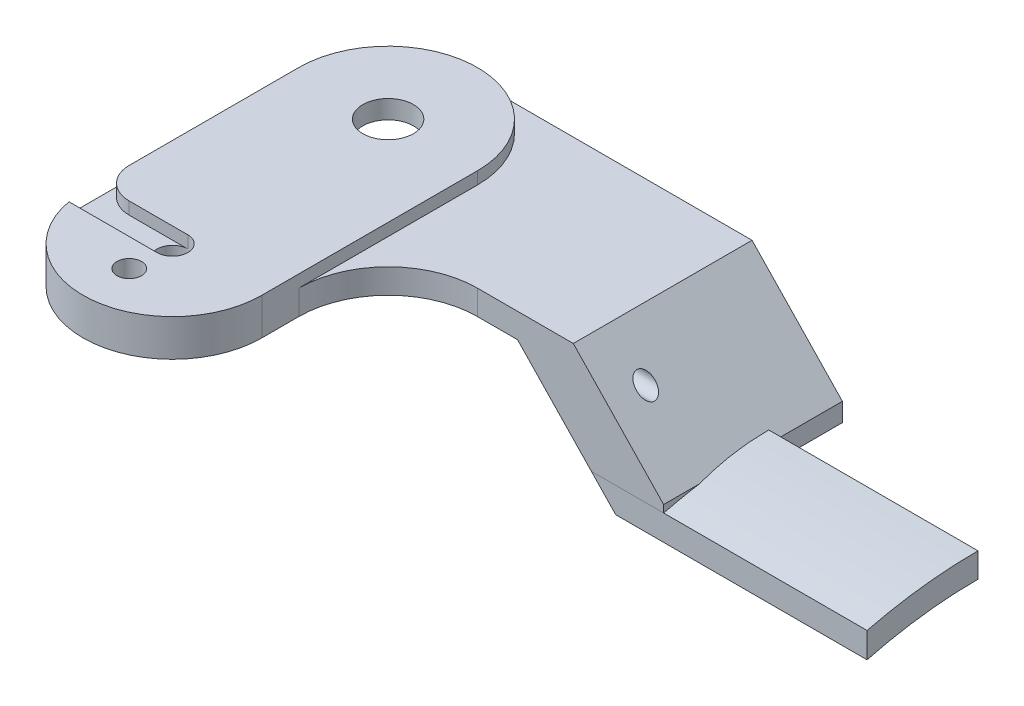
ISO-10303-21;
HEADER;
FILE_DESCRIPTION(('STEP AP214'),'2;1');
FILE_NAME('part.step','',(''),(''),'','','');
FILE_SCHEMA(('AUTOMOTIVE_DESIGN { 1 0 10303 214 1 1 1 1 }'));
ENDSEC;
DATA;
#1=APPLICATION_CONTEXT('core data for automotive mechanical design processes');
#2=APPLICATION_PROTOCOL_DEFINITION('international standard','automotive_design',2000,#1);
#3=PRODUCT_CONTEXT('',#1,'mechanical');
#4=PRODUCT('Part','Part','',(#3));
#5=PRODUCT_RELATED_PRODUCT_CATEGORY('part','',(#4));
#6=PRODUCT_DEFINITION_FORMATION('','',#4);
#7=PRODUCT_DEFINITION_CONTEXT('part definition',#1,'design');
#8=PRODUCT_DEFINITION('design','',#6,#7);
#9=PRODUCT_DEFINITION_SHAPE('','',#8);
#10=(LENGTH_UNIT() NAMED_UNIT(*) SI_UNIT(.MILLI.,.METRE.));
#11=(NAMED_UNIT(*) PLANE_ANGLE_UNIT() SI_UNIT($,.RADIAN.));
#12=(NAMED_UNIT(*) SI_UNIT($,.STERADIAN.) SOLID_ANGLE_UNIT());
#13=UNCERTAINTY_MEASURE_WITH_UNIT(LENGTH_MEASURE(1.E-05),#10,'distance_accuracy_value','');
#14=(GEOMETRIC_REPRESENTATION_CONTEXT(3) GLOBAL_UNCERTAINTY_ASSIGNED_CONTEXT((#13)) GLOBAL_UNIT_ASSIGNED_CONTEXT((#10,
#11,#12)) REPRESENTATION_CONTEXT('',''));
#15=CARTESIAN_POINT('',(0.,0.,0.));
#16=DIRECTION('',(0.,0.,1.));
#17=DIRECTION('',(1.,0.,0.));
#18=AXIS2_PLACEMENT_3D('',#15,#16,#17);
#19=CARTESIAN_POINT('',(-23.5536395656841,-70.9998669622686,-3.50034682436351));
#20=DIRECTION('',(1.,0.,0.));
#21=DIRECTION('',(0.,0.,-1.));
#22=AXIS2_PLACEMENT_3D('',#19,#20,#21);
#23=CYLINDRICAL_SURFACE('',#22,75.);
#24=CARTESIAN_POINT('',(68.0208515652504,-70.9998669622686,-3.50034682436351));
#25=DIRECTION('',(0.722093301654681,0.691795680606233,0.));
#26=DIRECTION('',(0.691795680606233,-0.722093301654681,0.));
#27=AXIS2_PLACEMENT_3D('',#24,#25,#26);
#28=ELLIPSE('',#27,103.864694255073,75.);
#29=CARTESIAN_POINT('',(-1.73215316737219,1.80801389003082,14.5));
#30=VERTEX_POINT('',#29);
#31=CARTESIAN_POINT('',(-3.83229528789652,4.00013303773141,-3.50034682436353));
#32=VERTEX_POINT('',#31);
#33=EDGE_CURVE('E110',#30,#32,#28,.F.);
#34=ORIENTED_EDGE('',*,*,#33,.F.);
#35=DIRECTION('',(1.,0.,0.));
#36=VECTOR('',#35,1.);
#37=CARTESIAN_POINT('',(-23.5536395656841,1.80801389003082,14.5));
#38=LINE('',#37,#36);
#39=CARTESIAN_POINT('',(43.,1.80801389003082,14.5));
#40=VERTEX_POINT('',#39);
#41=EDGE_CURVE('E138',#30,#40,#38,.T.);
#42=ORIENTED_EDGE('',*,*,#41,.T.);
#43=CARTESIAN_POINT('',(43.,-70.9998669622686,-3.50034682436351));
#44=DIRECTION('',(1.,0.,0.));
#45=DIRECTION('',(0.,0.,-1.));
#46=AXIS2_PLACEMENT_3D('',#43,#44,#45);
#47=CIRCLE('',#46,75.);
#48=CARTESIAN_POINT('',(43.,4.00013303773141,-3.50034682436353));
#49=VERTEX_POINT('',#48);
#50=EDGE_CURVE('E142',#49,#40,#47,.T.);
#51=ORIENTED_EDGE('',*,*,#50,.F.);
#52=DIRECTION('',(1.,0.,0.));
#53=VECTOR('',#52,1.);
#54=CARTESIAN_POINT('',(-23.5536395656841,4.00013303773141,-3.50034682436353));
#55=LINE('',#54,#53);
#56=EDGE_CURVE('E165',#32,#49,#55,.T.);
#57=ORIENTED_EDGE('',*,*,#56,.F.);
#58=EDGE_LOOP('',(#34,#42,#51,#57));
#59=FACE_BOUND('',#58,.T.);
#60=ADVANCED_FACE('F102',(#59),#23,.T.);
#61=CARTESIAN_POINT('',(-23.5536395656841,4.00013303773141,-3.50034682436353));
#62=DIRECTION('',(0.,0.,-1.));
#63=DIRECTION('',(0.,1.,0.));
#64=AXIS2_PLACEMENT_3D('',#61,#62,#63);
#65=PLANE('',#64);
#66=DIRECTION('',(0.691795680606233,-0.722093301654681,0.));
#67=VECTOR('',#66,1.);
#68=CARTESIAN_POINT('',(-13.2705611543302,13.8517536136439,-3.50034682436351));
#69=LINE('',#68,#67);
#70=CARTESIAN_POINT('',(-0.000127455728693437,0.000133037731414598,-3.50034682436353));
#71=VERTEX_POINT('',#70);
#72=EDGE_CURVE('E116',#32,#71,#69,.T.);
#73=ORIENTED_EDGE('',*,*,#72,.F.);
#74=ORIENTED_EDGE('',*,*,#56,.T.);
#75=DIRECTION('',(0.,1.,0.));
#76=VECTOR('',#75,1.);
#77=CARTESIAN_POINT('',(43.,4.00013303773141,-3.50034682436353));
#78=LINE('',#77,#76);
#79=CARTESIAN_POINT('',(43.,0.000133037731414598,-3.50034682436353));
#80=VERTEX_POINT('',#79);
#81=EDGE_CURVE('E147',#80,#49,#78,.T.);
#82=ORIENTED_EDGE('',*,*,#81,.F.);
#83=DIRECTION('',(1.,0.,0.));
#84=VECTOR('',#83,1.);
#85=CARTESIAN_POINT('',(-23.5536395656841,0.000133037731414598,-3.50034682436353));
#86=LINE('',#85,#84);
#87=EDGE_CURVE('E168',#71,#80,#86,.T.);
#88=ORIENTED_EDGE('',*,*,#87,.F.);
#89=EDGE_LOOP('',(#73,#74,#82,#88));
#90=FACE_BOUND('',#89,.T.);
#91=ADVANCED_FACE('F174',(#90),#65,.T.);
#92=CARTESIAN_POINT('',(-23.5536395656841,-70.9998669622686,-3.50034682436351));
#93=DIRECTION('',(1.,0.,0.));
#94=DIRECTION('',(0.,0.,-1.));
#95=AXIS2_PLACEMENT_3D('',#92,#93,#94);
#96=CYLINDRICAL_SURFACE('',#95,71.);
#97=CARTESIAN_POINT('',(68.0208515652504,-70.9998669622686,-3.50034682436351));
#98=DIRECTION('',(0.722093301654681,0.691795680606233,0.));
#99=DIRECTION('',(0.691795680606233,-0.722093301654681,0.));
#100=AXIS2_PLACEMENT_3D('',#97,#98,#99);
#101=ELLIPSE('',#100,98.3252438948029,71.);
#102=CARTESIAN_POINT('',(2.22221523058272,-2.31953852535277,14.5));
#103=VERTEX_POINT('',#102);
#104=EDGE_CURVE('E167',#71,#103,#101,.T.);
#105=ORIENTED_EDGE('',*,*,#104,.F.);
#106=ORIENTED_EDGE('',*,*,#87,.T.);
#107=CARTESIAN_POINT('',(43.,-70.9998669622686,-3.50034682436351));
#108=DIRECTION('',(-1.,0.,0.));
#109=DIRECTION('',(0.,0.,-1.));
#110=AXIS2_PLACEMENT_3D('',#107,#108,#109);
#111=CIRCLE('',#110,71.);
#112=CARTESIAN_POINT('',(43.,-2.31953852535277,14.5));
#113=VERTEX_POINT('',#112);
#114=EDGE_CURVE('E155',#113,#80,#111,.T.);
#115=ORIENTED_EDGE('',*,*,#114,.F.);
#116=DIRECTION('',(1.,0.,0.));
#117=VECTOR('',#116,1.);
#118=CARTESIAN_POINT('',(-23.5536395656841,-2.31953852535277,14.5));
#119=LINE('',#118,#117);
#120=EDGE_CURVE('E146',#103,#113,#119,.T.);
#121=ORIENTED_EDGE('',*,*,#120,.F.);
#122=EDGE_LOOP('',(#105,#106,#115,#121));
#123=FACE_BOUND('',#122,.T.);
#124=ADVANCED_FACE('F172',(#123),#96,.F.);
#125=CARTESIAN_POINT('',(-23.5536395656841,1.80801389003082,14.5));
#126=DIRECTION('',(0.,0.,1.));
#127=DIRECTION('',(0.,-1.,0.));
#128=AXIS2_PLACEMENT_3D('',#125,#126,#127);
#129=PLANE('',#128);
#130=DIRECTION('',(-0.691795680606233,0.722093301654681,0.));
#131=VECTOR('',#130,1.);
#132=CARTESIAN_POINT('',(-12.1755077038074,12.7087416178428,14.5));
#133=LINE('',#132,#131);
#134=EDGE_CURVE('E13',#103,#30,#133,.T.);
#135=ORIENTED_EDGE('',*,*,#134,.F.);
#136=ORIENTED_EDGE('',*,*,#120,.T.);
#137=DIRECTION('',(0.,-1.,0.));
#138=VECTOR('',#137,1.);
#139=CARTESIAN_POINT('',(43.,1.80801389003082,14.5));
#140=LINE('',#139,#138);
#141=EDGE_CURVE('E149',#40,#113,#140,.T.);
#142=ORIENTED_EDGE('',*,*,#141,.F.);
#143=ORIENTED_EDGE('',*,*,#41,.F.);
#144=EDGE_LOOP('',(#135,#136,#142,#143));
#145=FACE_BOUND('',#144,.T.);
#146=ADVANCED_FACE('F150',(#145),#129,.T.);
#147=CARTESIAN_POINT('',(43.,-70.9998669622686,-3.50034682436351));
#148=DIRECTION('',(1.,0.,0.));
#149=DIRECTION('',(0.,0.,-1.));
#150=AXIS2_PLACEMENT_3D('',#147,#148,#149);
#151=PLANE('',#150);
#152=ORIENTED_EDGE('',*,*,#50,.T.);
#153=ORIENTED_EDGE('',*,*,#141,.T.);
#154=ORIENTED_EDGE('',*,*,#114,.T.);
#155=ORIENTED_EDGE('',*,*,#81,.T.);
#156=EDGE_LOOP('',(#152,#153,#154,#155));
#157=FACE_BOUND('',#156,.T.);
#158=ADVANCED_FACE('F157',(#157),#151,.T.);
#159=CARTESIAN_POINT('',(0.,0.,14.5));
#160=DIRECTION('',(0.722093301654681,0.691795680606233,0.));
#161=DIRECTION('',(-0.691795680606233,0.722093301654681,0.));
#162=AXIS2_PLACEMENT_3D('',#159,#160,#161);
#163=PLANE('',#162);
#164=ORIENTED_EDGE('',*,*,#33,.T.);
#165=ORIENTED_EDGE('',*,*,#72,.T.);
#166=ORIENTED_EDGE('',*,*,#104,.T.);
#167=ORIENTED_EDGE('',*,*,#134,.T.);
#168=EDGE_LOOP('',(#164,#165,#166,#167));
#169=FACE_BOUND('',#168,.T.);
#170=ADVANCED_FACE('F176',(#169),#163,.F.);
#171=CLOSED_SHELL('',(#60,#91,#124,#146,#158,#170));
#172=MANIFOLD_SOLID_BREP('B2',#171);
#173=CARTESIAN_POINT('',(-63.7,18.3,14.5));
#174=DIRECTION('',(0.,-1.,0.));
#175=DIRECTION('',(1.,0.,0.));
#176=AXIS2_PLACEMENT_3D('',#173,#174,#175);
#177=PLANE('',#176);
#178=DIRECTION('',(-1.,0.,0.));
#179=VECTOR('',#178,1.);
#180=CARTESIAN_POINT('',(0.,18.3,37.5));
#181=LINE('',#180,#179);
#182=CARTESIAN_POINT('',(-49.2,18.3,37.5));
#183=VERTEX_POINT('',#182);
#184=CARTESIAN_POINT('',(-63.4828568570857,18.3,37.5));
#185=VERTEX_POINT('',#184);
#186=EDGE_CURVE('E466',#183,#185,#181,.T.);
#187=ORIENTED_EDGE('',*,*,#186,.F.);
#188=CARTESIAN_POINT('',(-49.2,18.3,35.));
#189=DIRECTION('',(0.,1.,0.));
#190=DIRECTION('',(0.,0.,1.));
#191=AXIS2_PLACEMENT_3D('',#188,#189,#190);
#192=CIRCLE('',#191,2.5);
#193=CARTESIAN_POINT('',(-49.2,18.3,32.5));
#194=VERTEX_POINT('',#193);
#195=EDGE_CURVE('E438',#194,#183,#192,.T.);
#196=ORIENTED_EDGE('',*,*,#195,.F.);
#197=DIRECTION('',(-1.,0.,0.));
#198=VECTOR('',#197,1.);
#199=CARTESIAN_POINT('',(0.,18.3,32.5));
#200=LINE('',#199,#198);
#201=CARTESIAN_POINT('',(-58.7,18.3,32.5));
#202=VERTEX_POINT('',#201);
#203=EDGE_CURVE('E251',#194,#202,#200,.T.);
#204=ORIENTED_EDGE('',*,*,#203,.T.);
#205=CARTESIAN_POINT('',(-58.7,18.3,27.5));
#206=DIRECTION('',(0.,1.,0.));
#207=DIRECTION('',(0.,0.,1.));
#208=AXIS2_PLACEMENT_3D('',#205,#206,#207);
#209=CIRCLE('',#208,5.);
#210=CARTESIAN_POINT('',(-63.7,18.3,27.5));
#211=VERTEX_POINT('',#210);
#212=EDGE_CURVE('E476',#202,#211,#209,.F.);
#213=ORIENTED_EDGE('',*,*,#212,.T.);
#214=DIRECTION('',(0.,0.,-1.));
#215=VECTOR('',#214,1.);
#216=CARTESIAN_POINT('',(-63.7,18.3,14.5));
#217=LINE('',#216,#215);
#218=CARTESIAN_POINT('',(-63.7,18.3,35.));
#219=VERTEX_POINT('',#218);
#220=EDGE_CURVE('E401',#219,#211,#217,.T.);
#221=ORIENTED_EDGE('',*,*,#220,.F.);
#222=CARTESIAN_POINT('',(-49.2,18.3,35.));
#223=DIRECTION('',(0.,-1.,0.));
#224=DIRECTION('',(1.,0.,0.));
#225=AXIS2_PLACEMENT_3D('',#222,#223,#224);
#226=CIRCLE('',#225,14.5);
#227=EDGE_CURVE('E434',#219,#185,#226,.F.);
#228=ORIENTED_EDGE('',*,*,#227,.T.);
#229=EDGE_LOOP('',(#187,#196,#204,#213,#221,#228));
#230=FACE_BOUND('',#229,.T.);
#231=ADVANCED_FACE('F226',(#230),#177,.F.);
#232=DIRECTION('',(0.,0.,-1.));
#233=VECTOR('',#232,1.);
#234=CARTESIAN_POINT('',(-34.7,18.3,0.));
#235=LINE('',#234,#233);
#236=CARTESIAN_POINT('',(-34.7,18.3,29.));
#237=VERTEX_POINT('',#236);
#238=CARTESIAN_POINT('',(-34.7,18.3,0.));
#239=VERTEX_POINT('',#238);
#240=EDGE_CURVE('E470',#237,#239,#235,.T.);
#241=ORIENTED_EDGE('',*,*,#240,.F.);
#242=CARTESIAN_POINT('',(-20.2,18.3,29.));
#243=DIRECTION('',(0.,-1.,0.));
#244=DIRECTION('',(1.,0.,0.));
#245=AXIS2_PLACEMENT_3D('',#242,#243,#244);
#246=CIRCLE('',#245,14.5);
#247=CARTESIAN_POINT('',(-20.2,18.3,14.5));
#248=VERTEX_POINT('',#247);
#249=EDGE_CURVE('E100',#237,#248,#246,.T.);
#250=ORIENTED_EDGE('',*,*,#249,.T.);
#251=DIRECTION('',(-1.,0.,0.));
#252=VECTOR('',#251,1.);
#253=CARTESIAN_POINT('',(-63.7,18.3,14.5));
#254=LINE('',#253,#252);
#255=CARTESIAN_POINT('',(-4.65804195804196,18.3,14.5));
#256=VERTEX_POINT('',#255);
#257=EDGE_CURVE('E494',#256,#248,#254,.T.);
#258=ORIENTED_EDGE('',*,*,#257,.F.);
#259=DIRECTION('',(0.,0.,-1.));
#260=VECTOR('',#259,1.);
#261=CARTESIAN_POINT('',(-4.65804195804196,18.3,14.5));
#262=LINE('',#261,#260);
#263=CARTESIAN_POINT('',(-4.65804195804196,18.3,-14.5));
#264=VERTEX_POINT('',#263);
#265=EDGE_CURVE('E404',#256,#264,#262,.T.);
#266=ORIENTED_EDGE('',*,*,#265,.T.);
#267=DIRECTION('',(-1.,0.,0.));
#268=VECTOR('',#267,1.);
#269=CARTESIAN_POINT('',(-63.7,18.3,-14.5));
#270=LINE('',#269,#268);
#271=CARTESIAN_POINT('',(-49.2,18.3,-14.5));
#272=VERTEX_POINT('',#271);
#273=EDGE_CURVE('E376',#264,#272,#270,.T.);
#274=ORIENTED_EDGE('',*,*,#273,.T.);
#275=CARTESIAN_POINT('',(-49.2,18.3,0.));
#276=DIRECTION('',(0.,1.,0.));
#277=DIRECTION('',(0.,0.,1.));
#278=AXIS2_PLACEMENT_3D('',#275,#276,#277);
#279=CIRCLE('',#278,14.5);
#280=EDGE_CURVE('E406',#239,#272,#279,.T.);
#281=ORIENTED_EDGE('',*,*,#280,.F.);
#282=EDGE_LOOP('',(#241,#250,#258,#266,#274,#281));
#283=FACE_BOUND('',#282,.T.);
#284=ADVANCED_FACE('F557',(#283),#177,.F.);
#285=CARTESIAN_POINT('',(-49.2,2.70344878854061,0.));
#286=DIRECTION('',(0.,1.,0.));
#287=DIRECTION('',(0.,0.,1.));
#288=AXIS2_PLACEMENT_3D('',#285,#286,#287);
#289=CYLINDRICAL_SURFACE('',#288,4.1);
#290=CARTESIAN_POINT('',(-49.2,20.3,0.));
#291=DIRECTION('',(0.,1.,0.));
#292=DIRECTION('',(0.,0.,1.));
#293=AXIS2_PLACEMENT_3D('',#290,#291,#292);
#294=CIRCLE('',#293,4.1);
#295=CARTESIAN_POINT('',(-49.2,20.3,4.1));
#296=VERTEX_POINT('',#295);
#297=EDGE_CURVE('E383',#296,#296,#294,.F.);
#298=ORIENTED_EDGE('',*,*,#297,.F.);
#299=EDGE_LOOP('',(#298));
#300=FACE_BOUND('',#299,.T.);
#301=CARTESIAN_POINT('',(-49.2,17.3,0.));
#302=DIRECTION('',(0.,-1.,0.));
#303=DIRECTION('',(1.,0.,0.));
#304=AXIS2_PLACEMENT_3D('',#301,#302,#303);
#305=CIRCLE('',#304,4.1);
#306=CARTESIAN_POINT('',(-45.1,17.3,0.));
#307=VERTEX_POINT('',#306);
#308=EDGE_CURVE('E407',#307,#307,#305,.F.);
#309=ORIENTED_EDGE('',*,*,#308,.F.);
#310=EDGE_LOOP('',(#309));
#311=FACE_BOUND('',#310,.T.);
#312=ADVANCED_FACE('F562',(#300,#311),#289,.F.);
#313=CARTESIAN_POINT('',(-4.65804195804196,18.3,14.5));
#314=DIRECTION('',(-0.722093301654681,-0.691795680606234,0.));
#315=DIRECTION('',(0.691795680606234,-0.722093301654681,0.));
#316=AXIS2_PLACEMENT_3D('',#313,#314,#315);
#317=PLANE('',#316);
#318=CARTESIAN_POINT('',(1.0902097902098,12.3,8.5));
#319=DIRECTION('',(-0.722093301654681,-0.691795680606234,0.));
#320=DIRECTION('',(0.691795680606234,-0.722093301654681,0.));
#321=AXIS2_PLACEMENT_3D('',#318,#319,#320);
#322=ELLIPSE('',#321,2.07729388510147,1.5);
#323=CARTESIAN_POINT('',(2.52727272727273,10.8,8.5));
#324=VERTEX_POINT('',#323);
#325=EDGE_CURVE('E513',#324,#324,#322,.T.);
#326=ORIENTED_EDGE('',*,*,#325,.T.);
#327=EDGE_LOOP('',(#326));
#328=FACE_BOUND('',#327,.T.);
#329=DIRECTION('',(-0.691795680606234,0.722093301654681,0.));
#330=VECTOR('',#329,1.);
#331=CARTESIAN_POINT('',(-4.65804195804196,18.3,-14.5));
#332=LINE('',#331,#330);
#333=CARTESIAN_POINT('',(10.,3.,-14.5));
#334=VERTEX_POINT('',#333);
#335=EDGE_CURVE('E367',#334,#264,#332,.T.);
#336=ORIENTED_EDGE('',*,*,#335,.T.);
#337=ORIENTED_EDGE('',*,*,#265,.F.);
#338=DIRECTION('',(-0.691795680606234,0.722093301654681,0.));
#339=VECTOR('',#338,1.);
#340=CARTESIAN_POINT('',(-4.65804195804196,18.3,14.5));
#341=LINE('',#340,#339);
#342=CARTESIAN_POINT('',(10.,3.,14.5));
#343=VERTEX_POINT('',#342);
#344=EDGE_CURVE('E369',#343,#256,#341,.T.);
#345=ORIENTED_EDGE('',*,*,#344,.F.);
#346=DIRECTION('',(0.,0.,-1.));
#347=VECTOR('',#346,1.);
#348=CARTESIAN_POINT('',(10.,3.,14.5));
#349=LINE('',#348,#347);
#350=EDGE_CURVE('E355',#343,#334,#349,.T.);
#351=ORIENTED_EDGE('',*,*,#350,.T.);
#352=EDGE_LOOP('',(#336,#337,#345,#351));
#353=FACE_BOUND('',#352,.T.);
#354=ADVANCED_FACE('F365',(#328,#353),#317,.F.);
#355=CARTESIAN_POINT('',(-63.7,14.3,14.5));
#356=DIRECTION('',(1.,0.,0.));
#357=DIRECTION('',(0.,0.,-1.));
#358=AXIS2_PLACEMENT_3D('',#355,#356,#357);
#359=PLANE('',#358);
#360=ORIENTED_EDGE('',*,*,#220,.T.);
#361=DIRECTION('',(0.,-1.,0.));
#362=VECTOR('',#361,1.);
#363=CARTESIAN_POINT('',(-63.7,77.6694169396901,27.5));
#364=LINE('',#363,#362);
#365=CARTESIAN_POINT('',(-63.7,20.3,27.5));
#366=VERTEX_POINT('',#365);
#367=EDGE_CURVE('E477',#366,#211,#364,.T.);
#368=ORIENTED_EDGE('',*,*,#367,.F.);
#369=DIRECTION('',(0.,0.,1.));
#370=VECTOR('',#369,1.);
#371=CARTESIAN_POINT('',(-63.7,20.3,0.));
#372=LINE('',#371,#370);
#373=CARTESIAN_POINT('',(-63.7,20.3,0.));
#374=VERTEX_POINT('',#373);
#375=EDGE_CURVE('E439',#374,#366,#372,.T.);
#376=ORIENTED_EDGE('',*,*,#375,.F.);
#377=DIRECTION('',(0.,-1.,0.));
#378=VECTOR('',#377,1.);
#379=CARTESIAN_POINT('',(-63.7,77.6694169396901,0.));
#380=LINE('',#379,#378);
#381=CARTESIAN_POINT('',(-63.7,18.3,0.));
#382=VERTEX_POINT('',#381);
#383=EDGE_CURVE('E473',#374,#382,#380,.T.);
#384=ORIENTED_EDGE('',*,*,#383,.T.);
#385=DIRECTION('',(0.,-1.,0.));
#386=VECTOR('',#385,1.);
#387=CARTESIAN_POINT('',(-63.7,14.3,0.));
#388=LINE('',#387,#386);
#389=CARTESIAN_POINT('',(-63.7,14.3,0.));
#390=VERTEX_POINT('',#389);
#391=EDGE_CURVE('E413',#382,#390,#388,.T.);
#392=ORIENTED_EDGE('',*,*,#391,.T.);
#393=DIRECTION('',(0.,0.,-1.));
#394=VECTOR('',#393,1.);
#395=CARTESIAN_POINT('',(-63.7,14.3,14.5));
#396=LINE('',#395,#394);
#397=CARTESIAN_POINT('',(-63.7,14.3,35.));
#398=VERTEX_POINT('',#397);
#399=EDGE_CURVE('E398',#398,#390,#396,.T.);
#400=ORIENTED_EDGE('',*,*,#399,.F.);
#401=DIRECTION('',(0.,1.,0.));
#402=VECTOR('',#401,1.);
#403=CARTESIAN_POINT('',(-63.7,14.3,35.));
#404=LINE('',#403,#402);
#405=EDGE_CURVE('E411',#398,#219,#404,.T.);
#406=ORIENTED_EDGE('',*,*,#405,.T.);
#407=EDGE_LOOP('',(#360,#368,#376,#384,#392,#400,#406));
#408=FACE_BOUND('',#407,.T.);
#409=ADVANCED_FACE('F566',(#408),#359,.F.);
#410=CARTESIAN_POINT('',(-13.7,14.3,14.5));
#411=DIRECTION('',(0.,1.,0.));
#412=DIRECTION('',(-1.,0.,0.));
#413=AXIS2_PLACEMENT_3D('',#410,#411,#412);
#414=PLANE('',#413);
#415=CARTESIAN_POINT('',(-49.2,14.3,42.));
#416=DIRECTION('',(0.,1.,0.));
#417=DIRECTION('',(-1.,0.,0.));
#418=AXIS2_PLACEMENT_3D('',#415,#416,#417);
#419=CIRCLE('',#418,2.);
#420=CARTESIAN_POINT('',(-51.2,14.3,42.));
#421=VERTEX_POINT('',#420);
#422=EDGE_CURVE('E509',#421,#421,#419,.F.);
#423=ORIENTED_EDGE('',*,*,#422,.F.);
#424=EDGE_LOOP('',(#423));
#425=FACE_BOUND('',#424,.T.);
#426=CARTESIAN_POINT('',(-49.2,14.3,35.));
#427=DIRECTION('',(0.,1.,0.));
#428=DIRECTION('',(-1.,0.,0.));
#429=AXIS2_PLACEMENT_3D('',#426,#427,#428);
#430=CIRCLE('',#429,2.5);
#431=CARTESIAN_POINT('',(-51.7,14.3,35.));
#432=VERTEX_POINT('',#431);
#433=EDGE_CURVE('E442',#432,#432,#430,.F.);
#434=ORIENTED_EDGE('',*,*,#433,.F.);
#435=EDGE_LOOP('',(#434));
#436=FACE_BOUND('',#435,.T.);
#437=CARTESIAN_POINT('',(-49.2,14.3,0.));
#438=DIRECTION('',(0.,-1.,0.));
#439=DIRECTION('',(1.,0.,0.));
#440=AXIS2_PLACEMENT_3D('',#437,#438,#439);
#441=CIRCLE('',#440,10.5);
#442=CARTESIAN_POINT('',(-38.7,14.3,0.));
#443=VERTEX_POINT('',#442);
#444=EDGE_CURVE('E485',#443,#443,#441,.T.);
#445=ORIENTED_EDGE('',*,*,#444,.F.);
#446=EDGE_LOOP('',(#445));
#447=FACE_BOUND('',#446,.T.);
#448=ORIENTED_EDGE('',*,*,#399,.T.);
#449=CARTESIAN_POINT('',(-49.2,14.3,0.));
#450=DIRECTION('',(0.,1.,0.));
#451=DIRECTION('',(-1.,0.,0.));
#452=AXIS2_PLACEMENT_3D('',#449,#450,#451);
#453=CIRCLE('',#452,14.5);
#454=CARTESIAN_POINT('',(-49.2,14.3,-14.5));
#455=VERTEX_POINT('',#454);
#456=EDGE_CURVE('E421',#390,#455,#453,.F.);
#457=ORIENTED_EDGE('',*,*,#456,.T.);
#458=DIRECTION('',(1.,0.,0.));
#459=VECTOR('',#458,1.);
#460=CARTESIAN_POINT('',(-13.7,14.3,-14.5));
#461=LINE('',#460,#459);
#462=CARTESIAN_POINT('',(-13.7,14.3,-14.5));
#463=VERTEX_POINT('',#462);
#464=EDGE_CURVE('E380',#455,#463,#461,.T.);
#465=ORIENTED_EDGE('',*,*,#464,.T.);
#466=DIRECTION('',(0.,0.,-1.));
#467=VECTOR('',#466,1.);
#468=CARTESIAN_POINT('',(-13.7,14.3,14.5));
#469=LINE('',#468,#467);
#470=CARTESIAN_POINT('',(-13.7,14.3,14.5));
#471=VERTEX_POINT('',#470);
#472=EDGE_CURVE('E395',#471,#463,#469,.T.);
#473=ORIENTED_EDGE('',*,*,#472,.F.);
#474=DIRECTION('',(1.,0.,0.));
#475=VECTOR('',#474,1.);
#476=CARTESIAN_POINT('',(-13.7,14.3,14.5));
#477=LINE('',#476,#475);
#478=CARTESIAN_POINT('',(-20.2,14.3,14.5));
#479=VERTEX_POINT('',#478);
#480=EDGE_CURVE('E497',#479,#471,#477,.T.);
#481=ORIENTED_EDGE('',*,*,#480,.F.);
#482=CARTESIAN_POINT('',(-20.2,14.3,29.));
#483=DIRECTION('',(0.,1.,0.));
#484=DIRECTION('',(-1.,0.,0.));
#485=AXIS2_PLACEMENT_3D('',#482,#483,#484);
#486=CIRCLE('',#485,14.5);
#487=CARTESIAN_POINT('',(-34.7,14.3,29.));
#488=VERTEX_POINT('',#487);
#489=EDGE_CURVE('E235',#479,#488,#486,.T.);
#490=ORIENTED_EDGE('',*,*,#489,.T.);
#491=DIRECTION('',(0.,0.,-1.));
#492=VECTOR('',#491,1.);
#493=CARTESIAN_POINT('',(-34.7,14.3,49.5));
#494=LINE('',#493,#492);
#495=CARTESIAN_POINT('',(-34.7,14.3,35.));
#496=VERTEX_POINT('',#495);
#497=EDGE_CURVE('E482',#496,#488,#494,.T.);
#498=ORIENTED_EDGE('',*,*,#497,.F.);
#499=CARTESIAN_POINT('',(-49.2,14.3,35.));
#500=DIRECTION('',(0.,1.,0.));
#501=DIRECTION('',(-1.,0.,0.));
#502=AXIS2_PLACEMENT_3D('',#499,#500,#501);
#503=CIRCLE('',#502,14.5);
#504=CARTESIAN_POINT('',(-49.2,14.3,49.5));
#505=VERTEX_POINT('',#504);
#506=EDGE_CURVE('E419',#496,#505,#503,.F.);
#507=ORIENTED_EDGE('',*,*,#506,.T.);
#508=CARTESIAN_POINT('',(-49.2,14.3,35.));
#509=DIRECTION('',(0.,1.,0.));
#510=DIRECTION('',(-1.,0.,0.));
#511=AXIS2_PLACEMENT_3D('',#508,#509,#510);
#512=CIRCLE('',#511,14.5);
#513=EDGE_CURVE('E417',#505,#398,#512,.F.);
#514=ORIENTED_EDGE('',*,*,#513,.T.);
#515=EDGE_LOOP('',(#448,#457,#465,#473,#481,#490,#498,#507,#514));
#516=FACE_BOUND('',#515,.T.);
#517=ADVANCED_FACE('F595',(#425,#436,#447,#516),#414,.F.);
#518=CARTESIAN_POINT('',(0.,0.,14.5));
#519=DIRECTION('',(0.722093301654681,0.691795680606233,0.));
#520=DIRECTION('',(-0.691795680606233,0.722093301654681,0.));
#521=AXIS2_PLACEMENT_3D('',#518,#519,#520);
#522=PLANE('',#521);
#523=CARTESIAN_POINT('',(-11.7839160839161,12.3,8.5));
#524=DIRECTION('',(0.722093301654681,0.691795680606233,0.));
#525=DIRECTION('',(0.691795680606233,-0.722093301654681,0.));
#526=AXIS2_PLACEMENT_3D('',#523,#524,#525);
#527=ELLIPSE('',#526,2.07729388510147,1.5);
#528=CARTESIAN_POINT('',(-10.3468531468531,10.8,8.5));
#529=VERTEX_POINT('',#528);
#530=EDGE_CURVE('E230',#529,#529,#527,.T.);
#531=ORIENTED_EDGE('',*,*,#530,.T.);
#532=EDGE_LOOP('',(#531));
#533=FACE_BOUND('',#532,.T.);
#534=DIRECTION('',(0.691795680606233,-0.722093301654681,0.));
#535=VECTOR('',#534,1.);
#536=CARTESIAN_POINT('',(0.,0.,-14.5));
#537=LINE('',#536,#535);
#538=CARTESIAN_POINT('',(0.,0.,-14.5));
#539=VERTEX_POINT('',#538);
#540=EDGE_CURVE('E389',#463,#539,#537,.T.);
#541=ORIENTED_EDGE('',*,*,#540,.T.);
#542=DIRECTION('',(0.,0.,-1.));
#543=VECTOR('',#542,1.);
#544=CARTESIAN_POINT('',(0.,0.,14.5));
#545=LINE('',#544,#543);
#546=CARTESIAN_POINT('',(0.,0.,14.5));
#547=VERTEX_POINT('',#546);
#548=EDGE_CURVE('E370',#547,#539,#545,.T.);
#549=ORIENTED_EDGE('',*,*,#548,.F.);
#550=DIRECTION('',(0.691795680606233,-0.722093301654681,0.));
#551=VECTOR('',#550,1.);
#552=CARTESIAN_POINT('',(0.,0.,14.5));
#553=LINE('',#552,#551);
#554=EDGE_CURVE('E498',#471,#547,#553,.T.);
#555=ORIENTED_EDGE('',*,*,#554,.F.);
#556=ORIENTED_EDGE('',*,*,#472,.T.);
#557=EDGE_LOOP('',(#541,#549,#555,#556));
#558=FACE_BOUND('',#557,.T.);
#559=ADVANCED_FACE('F597',(#533,#558),#522,.F.);
#560=CARTESIAN_POINT('',(43.,0.,14.5));
#561=DIRECTION('',(0.,1.,0.));
#562=DIRECTION('',(-1.,0.,0.));
#563=AXIS2_PLACEMENT_3D('',#560,#561,#562);
#564=PLANE('',#563);
#565=DIRECTION('',(1.,0.,0.));
#566=VECTOR('',#565,1.);
#567=CARTESIAN_POINT('',(43.,0.,-14.5));
#568=LINE('',#567,#566);
#569=CARTESIAN_POINT('',(10.,0.,-14.5));
#570=VERTEX_POINT('',#569);
#571=EDGE_CURVE('E391',#539,#570,#568,.T.);
#572=ORIENTED_EDGE('',*,*,#571,.T.);
#573=DIRECTION('',(0.,0.,1.));
#574=VECTOR('',#573,1.);
#575=CARTESIAN_POINT('',(10.,0.,-14.5));
#576=LINE('',#575,#574);
#577=CARTESIAN_POINT('',(10.,0.,14.5));
#578=VERTEX_POINT('',#577);
#579=EDGE_CURVE('E243',#570,#578,#576,.T.);
#580=ORIENTED_EDGE('',*,*,#579,.T.);
#581=DIRECTION('',(1.,0.,0.));
#582=VECTOR('',#581,1.);
#583=CARTESIAN_POINT('',(43.,0.,14.5));
#584=LINE('',#583,#582);
#585=EDGE_CURVE('E371',#547,#578,#584,.T.);
#586=ORIENTED_EDGE('',*,*,#585,.F.);
#587=ORIENTED_EDGE('',*,*,#548,.T.);
#588=EDGE_LOOP('',(#572,#580,#586,#587));
#589=FACE_BOUND('',#588,.T.);
#590=ADVANCED_FACE('F507',(#589),#564,.F.);
#591=CARTESIAN_POINT('',(0.,0.,14.5));
#592=DIRECTION('',(0.,0.,1.));
#593=DIRECTION('',(1.,0.,0.));
#594=AXIS2_PLACEMENT_3D('',#591,#592,#593);
#595=PLANE('',#594);
#596=DIRECTION('',(0.,-1.,0.));
#597=VECTOR('',#596,1.);
#598=CARTESIAN_POINT('',(10.,3.,14.5));
#599=LINE('',#598,#597);
#600=EDGE_CURVE('E505',#343,#578,#599,.T.);
#601=ORIENTED_EDGE('',*,*,#600,.F.);
#602=ORIENTED_EDGE('',*,*,#344,.T.);
#603=ORIENTED_EDGE('',*,*,#257,.T.);
#604=DIRECTION('',(0.,-1.,0.));
#605=VECTOR('',#604,1.);
#606=CARTESIAN_POINT('',(-20.2,14.3,14.5));
#607=LINE('',#606,#605);
#608=EDGE_CURVE('E425',#248,#479,#607,.T.);
#609=ORIENTED_EDGE('',*,*,#608,.T.);
#610=ORIENTED_EDGE('',*,*,#480,.T.);
#611=ORIENTED_EDGE('',*,*,#554,.T.);
#612=ORIENTED_EDGE('',*,*,#585,.T.);
#613=EDGE_LOOP('',(#601,#602,#603,#609,#610,#611,#612));
#614=FACE_BOUND('',#613,.T.);
#615=ADVANCED_FACE('F504',(#614),#595,.T.);
#616=CARTESIAN_POINT('',(0.,0.,-14.5));
#617=DIRECTION('',(0.,0.,1.));
#618=DIRECTION('',(1.,0.,0.));
#619=AXIS2_PLACEMENT_3D('',#616,#617,#618);
#620=PLANE('',#619);
#621=ORIENTED_EDGE('',*,*,#335,.F.);
#622=DIRECTION('',(0.,1.,0.));
#623=VECTOR('',#622,1.);
#624=CARTESIAN_POINT('',(10.,-34.7850542618522,-14.5));
#625=LINE('',#624,#623);
#626=EDGE_CURVE('E352',#570,#334,#625,.T.);
#627=ORIENTED_EDGE('',*,*,#626,.F.);
#628=ORIENTED_EDGE('',*,*,#571,.F.);
#629=ORIENTED_EDGE('',*,*,#540,.F.);
#630=ORIENTED_EDGE('',*,*,#464,.F.);
#631=DIRECTION('',(0.,-1.,0.));
#632=VECTOR('',#631,1.);
#633=CARTESIAN_POINT('',(-49.2,0.,-14.5));
#634=LINE('',#633,#632);
#635=EDGE_CURVE('E423',#455,#272,#634,.F.);
#636=ORIENTED_EDGE('',*,*,#635,.T.);
#637=ORIENTED_EDGE('',*,*,#273,.F.);
#638=EDGE_LOOP('',(#621,#627,#628,#629,#630,#636,#637));
#639=FACE_BOUND('',#638,.T.);
#640=ADVANCED_FACE('F373',(#639),#620,.F.);
#641=CARTESIAN_POINT('',(-49.2,20.3,0.));
#642=DIRECTION('',(0.,-1.,0.));
#643=DIRECTION('',(0.,0.,-1.));
#644=AXIS2_PLACEMENT_3D('',#641,#642,#643);
#645=CYLINDRICAL_SURFACE('',#644,14.5);
#646=CARTESIAN_POINT('',(-49.2,20.3,0.));
#647=DIRECTION('',(0.,1.,0.));
#648=DIRECTION('',(0.,0.,1.));
#649=AXIS2_PLACEMENT_3D('',#646,#647,#648);
#650=CIRCLE('',#649,14.5);
#651=CARTESIAN_POINT('',(-34.7,20.3,0.));
#652=VERTEX_POINT('',#651);
#653=EDGE_CURVE('E378',#652,#374,#650,.T.);
#654=ORIENTED_EDGE('',*,*,#653,.F.);
#655=DIRECTION('',(0.,-1.,0.));
#656=VECTOR('',#655,1.);
#657=CARTESIAN_POINT('',(-34.7,77.6694169396901,0.));
#658=LINE('',#657,#656);
#659=EDGE_CURVE('E471',#652,#239,#658,.T.);
#660=ORIENTED_EDGE('',*,*,#659,.T.);
#661=ORIENTED_EDGE('',*,*,#280,.T.);
#662=EDGE_CURVE('E414',#272,#382,#279,.T.);
#663=ORIENTED_EDGE('',*,*,#662,.T.);
#664=ORIENTED_EDGE('',*,*,#383,.F.);
#665=EDGE_LOOP('',(#654,#660,#661,#663,#664));
#666=FACE_BOUND('',#665,.T.);
#667=ADVANCED_FACE('F541',(#666),#645,.T.);
#668=CARTESIAN_POINT('',(0.,20.3,0.));
#669=DIRECTION('',(0.,1.,0.));
#670=DIRECTION('',(0.,0.,1.));
#671=AXIS2_PLACEMENT_3D('',#668,#669,#670);
#672=PLANE('',#671);
#673=CARTESIAN_POINT('',(-49.2,20.3,42.));
#674=DIRECTION('',(0.,1.,0.));
#675=DIRECTION('',(0.,0.,1.));
#676=AXIS2_PLACEMENT_3D('',#673,#674,#675);
#677=CIRCLE('',#676,2.);
#678=CARTESIAN_POINT('',(-49.2,20.3,44.));
#679=VERTEX_POINT('',#678);
#680=EDGE_CURVE('E905',#679,#679,#677,.T.);
#681=ORIENTED_EDGE('',*,*,#680,.F.);
#682=EDGE_LOOP('',(#681));
#683=FACE_BOUND('',#682,.T.);
#684=ORIENTED_EDGE('',*,*,#297,.T.);
#685=EDGE_LOOP('',(#684));
#686=FACE_BOUND('',#685,.T.);
#687=ORIENTED_EDGE('',*,*,#653,.T.);
#688=ORIENTED_EDGE('',*,*,#375,.T.);
#689=CARTESIAN_POINT('',(-58.7,20.3,27.5));
#690=DIRECTION('',(0.,1.,0.));
#691=DIRECTION('',(0.,0.,1.));
#692=AXIS2_PLACEMENT_3D('',#689,#690,#691);
#693=CIRCLE('',#692,5.);
#694=CARTESIAN_POINT('',(-58.7,20.3,32.5));
#695=VERTEX_POINT('',#694);
#696=EDGE_CURVE('E455',#695,#366,#693,.F.);
#697=ORIENTED_EDGE('',*,*,#696,.F.);
#698=DIRECTION('',(-1.,0.,0.));
#699=VECTOR('',#698,1.);
#700=CARTESIAN_POINT('',(0.,20.3,32.5));
#701=LINE('',#700,#699);
#702=CARTESIAN_POINT('',(-49.2,20.3,32.5));
#703=VERTEX_POINT('',#702);
#704=EDGE_CURVE('E460',#703,#695,#701,.T.);
#705=ORIENTED_EDGE('',*,*,#704,.F.);
#706=CARTESIAN_POINT('',(-49.2,20.3,35.));
#707=DIRECTION('',(0.,1.,0.));
#708=DIRECTION('',(0.,0.,1.));
#709=AXIS2_PLACEMENT_3D('',#706,#707,#708);
#710=CIRCLE('',#709,2.5);
#711=CARTESIAN_POINT('',(-49.2,20.3,37.5));
#712=VERTEX_POINT('',#711);
#713=EDGE_CURVE('E521',#703,#712,#710,.F.);
#714=ORIENTED_EDGE('',*,*,#713,.T.);
#715=DIRECTION('',(-1.,0.,0.));
#716=VECTOR('',#715,1.);
#717=CARTESIAN_POINT('',(0.,20.3,37.5));
#718=LINE('',#717,#716);
#719=CARTESIAN_POINT('',(-63.4828568570857,20.3,37.5));
#720=VERTEX_POINT('',#719);
#721=EDGE_CURVE('E525',#712,#720,#718,.T.);
#722=ORIENTED_EDGE('',*,*,#721,.T.);
#723=CARTESIAN_POINT('',(-49.2,20.3,35.));
#724=DIRECTION('',(0.,1.,0.));
#725=DIRECTION('',(0.,0.,1.));
#726=AXIS2_PLACEMENT_3D('',#723,#724,#725);
#727=CIRCLE('',#726,14.5);
#728=CARTESIAN_POINT('',(-34.7,20.3,35.));
#729=VERTEX_POINT('',#728);
#730=EDGE_CURVE('E451',#720,#729,#727,.T.);
#731=ORIENTED_EDGE('',*,*,#730,.T.);
#732=DIRECTION('',(0.,0.,-1.));
#733=VECTOR('',#732,1.);
#734=CARTESIAN_POINT('',(-34.7,20.3,0.));
#735=LINE('',#734,#733);
#736=EDGE_CURVE('E445',#729,#652,#735,.T.);
#737=ORIENTED_EDGE('',*,*,#736,.T.);
#738=EDGE_LOOP('',(#687,#688,#697,#705,#714,#722,#731,#737));
#739=FACE_BOUND('',#738,.T.);
#740=ADVANCED_FACE('F538',(#683,#686,#739),#672,.T.);
#741=CARTESIAN_POINT('',(-49.2,17.3,0.));
#742=DIRECTION('',(0.,-1.,0.));
#743=DIRECTION('',(1.,0.,0.));
#744=AXIS2_PLACEMENT_3D('',#741,#742,#743);
#745=PLANE('',#744);
#746=CARTESIAN_POINT('',(-49.2,17.3,0.));
#747=DIRECTION('',(0.,-1.,0.));
#748=DIRECTION('',(1.,0.,0.));
#749=AXIS2_PLACEMENT_3D('',#746,#747,#748);
#750=CIRCLE('',#749,10.5);
#751=CARTESIAN_POINT('',(-38.7,17.3,0.));
#752=VERTEX_POINT('',#751);
#753=EDGE_CURVE('E410',#752,#752,#750,.T.);
#754=ORIENTED_EDGE('',*,*,#753,.T.);
#755=EDGE_LOOP('',(#754));
#756=FACE_BOUND('',#755,.T.);
#757=ORIENTED_EDGE('',*,*,#308,.T.);
#758=EDGE_LOOP('',(#757));
#759=FACE_BOUND('',#758,.T.);
#760=ADVANCED_FACE('F540',(#756,#759),#745,.T.);
#761=CARTESIAN_POINT('',(-49.2,17.3,0.));
#762=DIRECTION('',(0.,-1.,0.));
#763=DIRECTION('',(1.,0.,0.));
#764=AXIS2_PLACEMENT_3D('',#761,#762,#763);
#765=CYLINDRICAL_SURFACE('',#764,10.5);
#766=ORIENTED_EDGE('',*,*,#753,.F.);
#767=EDGE_LOOP('',(#766));
#768=FACE_BOUND('',#767,.T.);
#769=ORIENTED_EDGE('',*,*,#444,.T.);
#770=EDGE_LOOP('',(#769));
#771=FACE_BOUND('',#770,.T.);
#772=ADVANCED_FACE('F548',(#768,#771),#765,.F.);
#773=CARTESIAN_POINT('',(-34.7,14.3,49.5));
#774=DIRECTION('',(1.,0.,0.));
#775=DIRECTION('',(0.,0.,-1.));
#776=AXIS2_PLACEMENT_3D('',#773,#774,#775);
#777=PLANE('',#776);
#778=ORIENTED_EDGE('',*,*,#497,.T.);
#779=DIRECTION('',(0.,-1.,0.));
#780=VECTOR('',#779,1.);
#781=CARTESIAN_POINT('',(-34.7,18.3,29.));
#782=LINE('',#781,#780);
#783=EDGE_CURVE('E431',#488,#237,#782,.F.);
#784=ORIENTED_EDGE('',*,*,#783,.T.);
#785=ORIENTED_EDGE('',*,*,#240,.T.);
#786=ORIENTED_EDGE('',*,*,#659,.F.);
#787=ORIENTED_EDGE('',*,*,#736,.F.);
#788=DIRECTION('',(0.,-1.,0.));
#789=VECTOR('',#788,1.);
#790=CARTESIAN_POINT('',(-34.7,14.3,35.));
#791=LINE('',#790,#789);
#792=EDGE_CURVE('E428',#729,#496,#791,.T.);
#793=ORIENTED_EDGE('',*,*,#792,.T.);
#794=EDGE_LOOP('',(#778,#784,#785,#786,#787,#793));
#795=FACE_BOUND('',#794,.T.);
#796=ADVANCED_FACE('F722',(#795),#777,.T.);
#797=CARTESIAN_POINT('',(-49.2,7.22893218813451,35.));
#798=DIRECTION('',(0.,1.,0.));
#799=DIRECTION('',(0.,0.,1.));
#800=AXIS2_PLACEMENT_3D('',#797,#798,#799);
#801=CYLINDRICAL_SURFACE('',#800,2.5);
#802=ORIENTED_EDGE('',*,*,#433,.T.);
#803=EDGE_LOOP('',(#802));
#804=FACE_BOUND('',#803,.T.);
#805=ORIENTED_EDGE('',*,*,#195,.T.);
#806=DIRECTION('',(0.,-1.,0.));
#807=VECTOR('',#806,1.);
#808=CARTESIAN_POINT('',(-49.2,77.6694169396901,37.5));
#809=LINE('',#808,#807);
#810=EDGE_CURVE('E463',#712,#183,#809,.T.);
#811=ORIENTED_EDGE('',*,*,#810,.F.);
#812=ORIENTED_EDGE('',*,*,#713,.F.);
#813=DIRECTION('',(0.,-1.,0.));
#814=VECTOR('',#813,1.);
#815=CARTESIAN_POINT('',(-49.2,77.6694169396901,32.5));
#816=LINE('',#815,#814);
#817=EDGE_CURVE('E459',#703,#194,#816,.T.);
#818=ORIENTED_EDGE('',*,*,#817,.T.);
#819=EDGE_LOOP('',(#805,#811,#812,#818));
#820=FACE_BOUND('',#819,.T.);
#821=ADVANCED_FACE('F574',(#804,#820),#801,.F.);
#822=CARTESIAN_POINT('',(-49.2,14.3,0.));
#823=DIRECTION('',(0.,-1.,0.));
#824=DIRECTION('',(0.,0.,-1.));
#825=AXIS2_PLACEMENT_3D('',#822,#823,#824);
#826=CYLINDRICAL_SURFACE('',#825,14.5);
#827=ORIENTED_EDGE('',*,*,#662,.F.);
#828=ORIENTED_EDGE('',*,*,#635,.F.);
#829=ORIENTED_EDGE('',*,*,#456,.F.);
#830=ORIENTED_EDGE('',*,*,#391,.F.);
#831=EDGE_LOOP('',(#827,#828,#829,#830));
#832=FACE_BOUND('',#831,.T.);
#833=ADVANCED_FACE('F571',(#832),#826,.T.);
#834=CARTESIAN_POINT('',(-20.2,0.,29.));
#835=DIRECTION('',(0.,1.,0.));
#836=DIRECTION('',(0.,0.,1.));
#837=AXIS2_PLACEMENT_3D('',#834,#835,#836);
#838=CYLINDRICAL_SURFACE('',#837,14.5);
#839=ORIENTED_EDGE('',*,*,#249,.F.);
#840=ORIENTED_EDGE('',*,*,#783,.F.);
#841=ORIENTED_EDGE('',*,*,#489,.F.);
#842=ORIENTED_EDGE('',*,*,#608,.F.);
#843=EDGE_LOOP('',(#839,#840,#841,#842));
#844=FACE_BOUND('',#843,.T.);
#845=ADVANCED_FACE('F573',(#844),#838,.F.);
#846=CARTESIAN_POINT('',(-49.2,14.3,35.));
#847=DIRECTION('',(0.,1.,0.));
#848=DIRECTION('',(0.,0.,1.));
#849=AXIS2_PLACEMENT_3D('',#846,#847,#848);
#850=CYLINDRICAL_SURFACE('',#849,14.5);
#851=DIRECTION('',(0.,1.,0.));
#852=VECTOR('',#851,1.);
#853=CARTESIAN_POINT('',(-49.2,0.,49.5));
#854=LINE('',#853,#852);
#855=CARTESIAN_POINT('',(-49.2,18.3,49.5));
#856=VERTEX_POINT('',#855);
#857=EDGE_CURVE('E436',#856,#505,#854,.F.);
#858=ORIENTED_EDGE('',*,*,#857,.F.);
#859=ORIENTED_EDGE('',*,*,#857,.T.);
#860=ORIENTED_EDGE('',*,*,#506,.F.);
#861=ORIENTED_EDGE('',*,*,#792,.F.);
#862=ORIENTED_EDGE('',*,*,#730,.F.);
#863=DIRECTION('',(0.,-1.,0.));
#864=VECTOR('',#863,1.);
#865=CARTESIAN_POINT('',(-63.4828568570857,77.6694169396901,37.5));
#866=LINE('',#865,#864);
#867=EDGE_CURVE('E467',#720,#185,#866,.T.);
#868=ORIENTED_EDGE('',*,*,#867,.T.);
#869=ORIENTED_EDGE('',*,*,#227,.F.);
#870=ORIENTED_EDGE('',*,*,#405,.F.);
#871=ORIENTED_EDGE('',*,*,#513,.F.);
#872=EDGE_LOOP('',(#858,#859,#860,#861,#862,#868,#869,#870,#871));
#873=FACE_BOUND('',#872,.T.);
#874=ADVANCED_FACE('F228',(#873),#850,.T.);
#875=CARTESIAN_POINT('',(0.,77.6694169396901,37.5));
#876=DIRECTION('',(0.,0.,1.));
#877=DIRECTION('',(1.,0.,0.));
#878=AXIS2_PLACEMENT_3D('',#875,#876,#877);
#879=PLANE('',#878);
#880=ORIENTED_EDGE('',*,*,#721,.F.);
#881=ORIENTED_EDGE('',*,*,#810,.T.);
#882=ORIENTED_EDGE('',*,*,#186,.T.);
#883=ORIENTED_EDGE('',*,*,#867,.F.);
#884=EDGE_LOOP('',(#880,#881,#882,#883));
#885=FACE_BOUND('',#884,.T.);
#886=ADVANCED_FACE('F581',(#885),#879,.F.);
#887=CARTESIAN_POINT('',(-58.7,77.6694169396901,27.5));
#888=DIRECTION('',(0.,-1.,0.));
#889=DIRECTION('',(0.,0.,-1.));
#890=AXIS2_PLACEMENT_3D('',#887,#888,#889);
#891=CYLINDRICAL_SURFACE('',#890,5.);
#892=DIRECTION('',(0.,-1.,0.));
#893=VECTOR('',#892,1.);
#894=CARTESIAN_POINT('',(-58.7,77.6694169396901,32.5));
#895=LINE('',#894,#893);
#896=EDGE_CURVE('E457',#695,#202,#895,.T.);
#897=ORIENTED_EDGE('',*,*,#896,.F.);
#898=ORIENTED_EDGE('',*,*,#696,.T.);
#899=ORIENTED_EDGE('',*,*,#367,.T.);
#900=ORIENTED_EDGE('',*,*,#212,.F.);
#901=EDGE_LOOP('',(#897,#898,#899,#900));
#902=FACE_BOUND('',#901,.T.);
#903=ADVANCED_FACE('F537',(#902),#891,.T.);
#904=CARTESIAN_POINT('',(0.,77.6694169396901,32.5));
#905=DIRECTION('',(0.,0.,1.));
#906=DIRECTION('',(1.,0.,0.));
#907=AXIS2_PLACEMENT_3D('',#904,#905,#906);
#908=PLANE('',#907);
#909=ORIENTED_EDGE('',*,*,#817,.F.);
#910=ORIENTED_EDGE('',*,*,#704,.T.);
#911=ORIENTED_EDGE('',*,*,#896,.T.);
#912=ORIENTED_EDGE('',*,*,#203,.F.);
#913=EDGE_LOOP('',(#909,#910,#911,#912));
#914=FACE_BOUND('',#913,.T.);
#915=ADVANCED_FACE('F533',(#914),#908,.T.);
#916=CARTESIAN_POINT('',(-16.,12.3,8.5));
#917=DIRECTION('',(1.,0.,0.));
#918=DIRECTION('',(0.,0.,-1.));
#919=AXIS2_PLACEMENT_3D('',#916,#917,#918);
#920=CYLINDRICAL_SURFACE('',#919,1.5);
#921=ORIENTED_EDGE('',*,*,#530,.F.);
#922=EDGE_LOOP('',(#921));
#923=FACE_BOUND('',#922,.T.);
#924=ORIENTED_EDGE('',*,*,#325,.F.);
#925=EDGE_LOOP('',(#924));
#926=FACE_BOUND('',#925,.T.);
#927=ADVANCED_FACE('F671',(#923,#926),#920,.F.);
#928=CARTESIAN_POINT('',(10.,3.,-14.5));
#929=DIRECTION('',(-1.,0.,0.));
#930=DIRECTION('',(0.,0.,1.));
#931=AXIS2_PLACEMENT_3D('',#928,#929,#930);
#932=PLANE('',#931);
#933=ORIENTED_EDGE('',*,*,#600,.T.);
#934=ORIENTED_EDGE('',*,*,#579,.F.);
#935=ORIENTED_EDGE('',*,*,#626,.T.);
#936=ORIENTED_EDGE('',*,*,#350,.F.);
#937=EDGE_LOOP('',(#933,#934,#935,#936));
#938=FACE_BOUND('',#937,.T.);
#939=ADVANCED_FACE('F354',(#938),#932,.F.);
#940=CARTESIAN_POINT('',(-49.2,8.64314575050761,42.));
#941=DIRECTION('',(0.,1.,0.));
#942=DIRECTION('',(0.,0.,1.));
#943=AXIS2_PLACEMENT_3D('',#940,#941,#942);
#944=CYLINDRICAL_SURFACE('',#943,2.);
#945=ORIENTED_EDGE('',*,*,#422,.T.);
#946=EDGE_LOOP('',(#945));
#947=FACE_BOUND('',#946,.T.);
#948=ORIENTED_EDGE('',*,*,#680,.T.);
#949=EDGE_LOOP('',(#948));
#950=FACE_BOUND('',#949,.T.);
#951=ADVANCED_FACE('F660',(#947,#950),#944,.F.);
#952=CLOSED_SHELL('',(#231,#284,#312,#354,#409,#517,#559,#590,#615,#640,#667,#740,#760,#772,
#796,#821,#833,#845,#874,#886,#903,#915,#927,#939,#951));
#953=MANIFOLD_SOLID_BREP('B7',#952);
#954=ADVANCED_BREP_SHAPE_REPRESENTATION('',(#18,#172,#953),#14);
#955=SHAPE_DEFINITION_REPRESENTATION(#9,#954);
ENDSEC;
END-ISO-10303-21;
